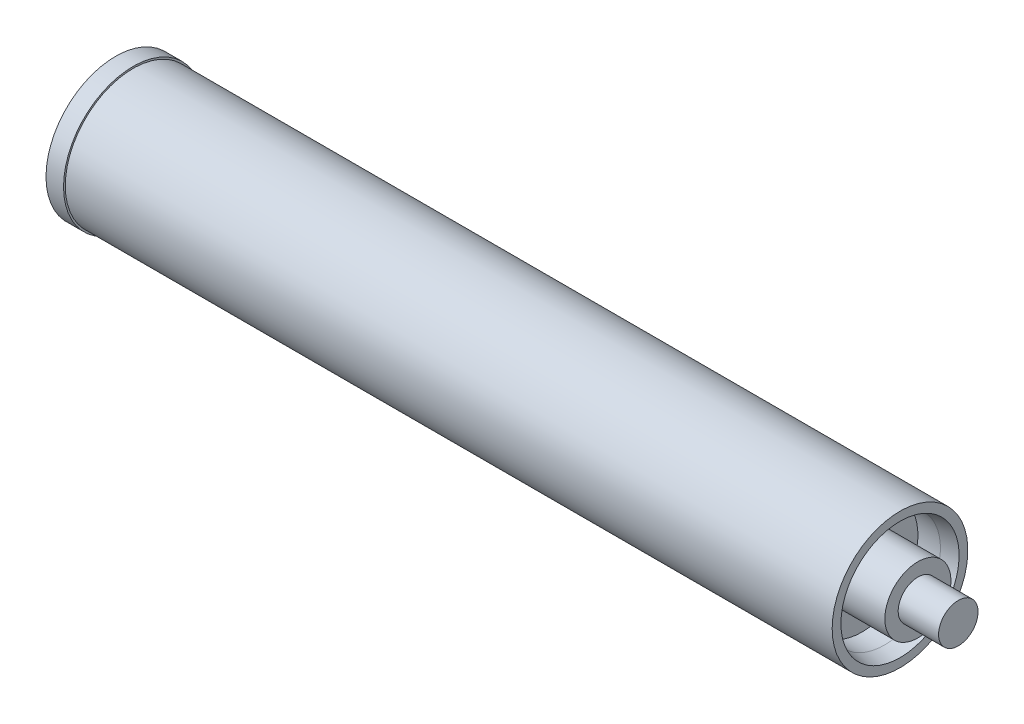
ISO-10303-21;
HEADER;
FILE_DESCRIPTION(('STEP AP214'),'2;1');
FILE_NAME('part.step','',(''),(''),'','','');
FILE_SCHEMA(('AUTOMOTIVE_DESIGN { 1 0 10303 214 1 1 1 1 }'));
ENDSEC;
DATA;
#1=APPLICATION_CONTEXT('core data for automotive mechanical design processes');
#2=APPLICATION_PROTOCOL_DEFINITION('international standard','automotive_design',2000,#1);
#3=PRODUCT_CONTEXT('',#1,'mechanical');
#4=PRODUCT('Part','Part','',(#3));
#5=PRODUCT_RELATED_PRODUCT_CATEGORY('part','',(#4));
#6=PRODUCT_DEFINITION_FORMATION('','',#4);
#7=PRODUCT_DEFINITION_CONTEXT('part definition',#1,'design');
#8=PRODUCT_DEFINITION('design','',#6,#7);
#9=PRODUCT_DEFINITION_SHAPE('','',#8);
#10=(LENGTH_UNIT() NAMED_UNIT(*) SI_UNIT(.MILLI.,.METRE.));
#11=(NAMED_UNIT(*) PLANE_ANGLE_UNIT() SI_UNIT($,.RADIAN.));
#12=(NAMED_UNIT(*) SI_UNIT($,.STERADIAN.) SOLID_ANGLE_UNIT());
#13=UNCERTAINTY_MEASURE_WITH_UNIT(LENGTH_MEASURE(1.E-05),#10,'distance_accuracy_value','');
#14=(GEOMETRIC_REPRESENTATION_CONTEXT(3) GLOBAL_UNCERTAINTY_ASSIGNED_CONTEXT((#13)) GLOBAL_UNIT_ASSIGNED_CONTEXT((#10,
#11,#12)) REPRESENTATION_CONTEXT('',''));
#15=CARTESIAN_POINT('',(0.,0.,0.));
#16=DIRECTION('',(0.,0.,1.));
#17=DIRECTION('',(1.,0.,0.));
#18=AXIS2_PLACEMENT_3D('',#15,#16,#17);
#19=CARTESIAN_POINT('',(36.5674158404261,35.6891384392189,0.));
#20=DIRECTION('',(1.,0.,0.));
#21=DIRECTION('',(0.,0.,-1.));
#22=AXIS2_PLACEMENT_3D('',#19,#20,#21);
#23=PLANE('',#22);
#24=CARTESIAN_POINT('',(36.5674158404261,0.,0.));
#25=DIRECTION('',(-1.,0.,0.));
#26=DIRECTION('',(0.,0.,1.));
#27=AXIS2_PLACEMENT_3D('',#24,#25,#26);
#28=CIRCLE('',#27,26.);
#29=CARTESIAN_POINT('',(36.5674158404261,0.,26.));
#30=VERTEX_POINT('',#29);
#31=EDGE_CURVE('E71',#30,#30,#28,.T.);
#32=ORIENTED_EDGE('',*,*,#31,.F.);
#33=EDGE_LOOP('',(#32));
#34=FACE_BOUND('',#33,.T.);
#35=CARTESIAN_POINT('',(36.5674158404261,0.,0.));
#36=DIRECTION('',(-1.,0.,0.));
#37=DIRECTION('',(0.,0.,1.));
#38=AXIS2_PLACEMENT_3D('',#35,#36,#37);
#39=CIRCLE('',#38,35.6891384392189);
#40=CARTESIAN_POINT('',(36.5674158404261,0.,35.6891384392189));
#41=VERTEX_POINT('',#40);
#42=EDGE_CURVE('E11',#41,#41,#39,.T.);
#43=ORIENTED_EDGE('',*,*,#42,.T.);
#44=EDGE_LOOP('',(#43));
#45=FACE_BOUND('',#44,.T.);
#46=ADVANCED_FACE('F34',(#34,#45),#23,.F.);
#47=CARTESIAN_POINT('',(0.,0.,0.));
#48=DIRECTION('',(-1.,0.,0.));
#49=DIRECTION('',(0.,0.,1.));
#50=AXIS2_PLACEMENT_3D('',#47,#48,#49);
#51=CYLINDRICAL_SURFACE('',#50,35.6891384392189);
#52=ORIENTED_EDGE('',*,*,#42,.F.);
#53=EDGE_LOOP('',(#52));
#54=FACE_BOUND('',#53,.T.);
#55=CARTESIAN_POINT('',(25.4,0.,0.));
#56=DIRECTION('',(-1.,0.,0.));
#57=DIRECTION('',(0.,0.,1.));
#58=AXIS2_PLACEMENT_3D('',#55,#56,#57);
#59=CIRCLE('',#58,35.6891384392189);
#60=CARTESIAN_POINT('',(25.4,0.,35.6891384392189));
#61=VERTEX_POINT('',#60);
#62=EDGE_CURVE('E40',#61,#61,#59,.T.);
#63=ORIENTED_EDGE('',*,*,#62,.T.);
#64=EDGE_LOOP('',(#63));
#65=FACE_BOUND('',#64,.T.);
#66=ADVANCED_FACE('F61',(#54,#65),#51,.F.);
#67=CARTESIAN_POINT('',(12.7,0.,0.));
#68=DIRECTION('',(-1.,0.,0.));
#69=DIRECTION('',(0.,0.,1.));
#70=AXIS2_PLACEMENT_3D('',#67,#68,#69);
#71=CONICAL_SURFACE('',#70,38.2095,0.195908259244877);
#72=ORIENTED_EDGE('',*,*,#62,.F.);
#73=EDGE_LOOP('',(#72));
#74=FACE_BOUND('',#73,.T.);
#75=CARTESIAN_POINT('',(12.7,0.,0.));
#76=DIRECTION('',(-1.,0.,0.));
#77=DIRECTION('',(0.,0.,1.));
#78=AXIS2_PLACEMENT_3D('',#75,#76,#77);
#79=CIRCLE('',#78,38.2095);
#80=CARTESIAN_POINT('',(12.7,0.,38.2095));
#81=VERTEX_POINT('',#80);
#82=EDGE_CURVE('E77',#81,#81,#79,.T.);
#83=ORIENTED_EDGE('',*,*,#82,.T.);
#84=EDGE_LOOP('',(#83));
#85=FACE_BOUND('',#84,.T.);
#86=ADVANCED_FACE('F66',(#74,#85),#71,.F.);
#87=CARTESIAN_POINT('',(12.7,50.419,0.));
#88=DIRECTION('',(1.,0.,0.));
#89=DIRECTION('',(0.,0.,-1.));
#90=AXIS2_PLACEMENT_3D('',#87,#88,#89);
#91=PLANE('',#90);
#92=ORIENTED_EDGE('',*,*,#82,.F.);
#93=EDGE_LOOP('',(#92));
#94=FACE_BOUND('',#93,.T.);
#95=CARTESIAN_POINT('',(12.7,0.,0.));
#96=DIRECTION('',(-1.,0.,0.));
#97=DIRECTION('',(0.,0.,1.));
#98=AXIS2_PLACEMENT_3D('',#95,#96,#97);
#99=CIRCLE('',#98,50.419);
#100=CARTESIAN_POINT('',(12.7,0.,50.419));
#101=VERTEX_POINT('',#100);
#102=EDGE_CURVE('E79',#101,#101,#99,.T.);
#103=ORIENTED_EDGE('',*,*,#102,.T.);
#104=EDGE_LOOP('',(#103));
#105=FACE_BOUND('',#104,.T.);
#106=ADVANCED_FACE('F193',(#94,#105),#91,.F.);
#107=CARTESIAN_POINT('',(0.,0.,0.));
#108=DIRECTION('',(-1.,0.,0.));
#109=DIRECTION('',(0.,0.,1.));
#110=AXIS2_PLACEMENT_3D('',#107,#108,#109);
#111=CYLINDRICAL_SURFACE('',#110,50.419);
#112=CARTESIAN_POINT('',(25.4,0.,0.));
#113=DIRECTION('',(-1.,0.,0.));
#114=DIRECTION('',(0.,0.,1.));
#115=AXIS2_PLACEMENT_3D('',#112,#113,#114);
#116=CIRCLE('',#115,50.419);
#117=CARTESIAN_POINT('',(25.4,0.,50.419));
#118=VERTEX_POINT('',#117);
#119=EDGE_CURVE('E84',#118,#118,#116,.T.);
#120=ORIENTED_EDGE('',*,*,#119,.T.);
#121=EDGE_LOOP('',(#120));
#122=FACE_BOUND('',#121,.T.);
#123=ORIENTED_EDGE('',*,*,#102,.F.);
#124=EDGE_LOOP('',(#123));
#125=FACE_BOUND('',#124,.T.);
#126=ADVANCED_FACE('F189',(#122,#125),#111,.T.);
#127=CARTESIAN_POINT('',(25.4,50.419,0.));
#128=DIRECTION('',(1.,0.,0.));
#129=DIRECTION('',(0.,0.,-1.));
#130=AXIS2_PLACEMENT_3D('',#127,#128,#129);
#131=PLANE('',#130);
#132=CARTESIAN_POINT('',(25.4,0.,0.));
#133=DIRECTION('',(-1.,0.,0.));
#134=DIRECTION('',(0.,0.,1.));
#135=AXIS2_PLACEMENT_3D('',#132,#133,#134);
#136=CIRCLE('',#135,49.149);
#137=CARTESIAN_POINT('',(25.4,0.,49.149));
#138=VERTEX_POINT('',#137);
#139=EDGE_CURVE('E87',#138,#138,#136,.T.);
#140=ORIENTED_EDGE('',*,*,#139,.T.);
#141=EDGE_LOOP('',(#140));
#142=FACE_BOUND('',#141,.T.);
#143=ORIENTED_EDGE('',*,*,#119,.F.);
#144=EDGE_LOOP('',(#143));
#145=FACE_BOUND('',#144,.T.);
#146=ADVANCED_FACE('F185',(#142,#145),#131,.T.);
#147=CARTESIAN_POINT('',(0.,0.,0.));
#148=DIRECTION('',(-1.,0.,0.));
#149=DIRECTION('',(0.,0.,1.));
#150=AXIS2_PLACEMENT_3D('',#147,#148,#149);
#151=CYLINDRICAL_SURFACE('',#150,49.149);
#152=CARTESIAN_POINT('',(581.02,0.,0.));
#153=DIRECTION('',(-1.,0.,0.));
#154=DIRECTION('',(0.,0.,1.));
#155=AXIS2_PLACEMENT_3D('',#152,#153,#154);
#156=CIRCLE('',#155,49.149);
#157=CARTESIAN_POINT('',(581.02,0.,49.149));
#158=VERTEX_POINT('',#157);
#159=EDGE_CURVE('E90',#158,#158,#156,.T.);
#160=ORIENTED_EDGE('',*,*,#159,.T.);
#161=EDGE_LOOP('',(#160));
#162=FACE_BOUND('',#161,.T.);
#163=ORIENTED_EDGE('',*,*,#139,.F.);
#164=EDGE_LOOP('',(#163));
#165=FACE_BOUND('',#164,.T.);
#166=ADVANCED_FACE('F181',(#162,#165),#151,.T.);
#167=CARTESIAN_POINT('',(581.02,49.149,0.));
#168=DIRECTION('',(1.,0.,0.));
#169=DIRECTION('',(0.,0.,-1.));
#170=AXIS2_PLACEMENT_3D('',#167,#168,#169);
#171=PLANE('',#170);
#172=CARTESIAN_POINT('',(581.02,0.,0.));
#173=DIRECTION('',(-1.,0.,0.));
#174=DIRECTION('',(0.,0.,1.));
#175=AXIS2_PLACEMENT_3D('',#172,#173,#174);
#176=CIRCLE('',#175,42.8201877110918);
#177=CARTESIAN_POINT('',(581.02,0.,42.8201877110918));
#178=VERTEX_POINT('',#177);
#179=EDGE_CURVE('E93',#178,#178,#176,.T.);
#180=ORIENTED_EDGE('',*,*,#179,.T.);
#181=EDGE_LOOP('',(#180));
#182=FACE_BOUND('',#181,.T.);
#183=ORIENTED_EDGE('',*,*,#159,.F.);
#184=EDGE_LOOP('',(#183));
#185=FACE_BOUND('',#184,.T.);
#186=ADVANCED_FACE('F177',(#182,#185),#171,.T.);
#187=CARTESIAN_POINT('',(581.02,0.,0.));
#188=DIRECTION('',(1.,0.,0.));
#189=DIRECTION('',(0.,0.,-1.));
#190=AXIS2_PLACEMENT_3D('',#187,#188,#189);
#191=CONICAL_SURFACE('',#190,42.8201877110918,0.195908259244877);
#192=CARTESIAN_POINT('',(569.697148349975,0.,0.));
#193=DIRECTION('',(-1.,0.,0.));
#194=DIRECTION('',(0.,0.,1.));
#195=AXIS2_PLACEMENT_3D('',#192,#193,#194);
#196=CIRCLE('',#195,40.573126289269);
#197=CARTESIAN_POINT('',(569.697148349975,0.,40.573126289269));
#198=VERTEX_POINT('',#197);
#199=EDGE_CURVE('E96',#198,#198,#196,.T.);
#200=ORIENTED_EDGE('',*,*,#199,.T.);
#201=EDGE_LOOP('',(#200));
#202=FACE_BOUND('',#201,.T.);
#203=ORIENTED_EDGE('',*,*,#179,.F.);
#204=EDGE_LOOP('',(#203));
#205=FACE_BOUND('',#204,.T.);
#206=ADVANCED_FACE('F173',(#202,#205),#191,.F.);
#207=CARTESIAN_POINT('',(0.,0.,0.));
#208=DIRECTION('',(-1.,0.,0.));
#209=DIRECTION('',(0.,0.,1.));
#210=AXIS2_PLACEMENT_3D('',#207,#208,#209);
#211=CYLINDRICAL_SURFACE('',#210,40.573126289269);
#212=CARTESIAN_POINT('',(553.411969833881,0.,0.));
#213=DIRECTION('',(-1.,0.,0.));
#214=DIRECTION('',(0.,0.,1.));
#215=AXIS2_PLACEMENT_3D('',#212,#213,#214);
#216=CIRCLE('',#215,40.573126289269);
#217=CARTESIAN_POINT('',(553.411969833881,0.,40.573126289269));
#218=VERTEX_POINT('',#217);
#219=EDGE_CURVE('E99',#218,#218,#216,.T.);
#220=ORIENTED_EDGE('',*,*,#219,.T.);
#221=EDGE_LOOP('',(#220));
#222=FACE_BOUND('',#221,.T.);
#223=ORIENTED_EDGE('',*,*,#199,.F.);
#224=EDGE_LOOP('',(#223));
#225=FACE_BOUND('',#224,.T.);
#226=ADVANCED_FACE('F169',(#222,#225),#211,.F.);
#227=CARTESIAN_POINT('',(553.411969833881,40.573126289269,0.));
#228=DIRECTION('',(1.,0.,0.));
#229=DIRECTION('',(0.,0.,-1.));
#230=AXIS2_PLACEMENT_3D('',#227,#228,#229);
#231=PLANE('',#230);
#232=CARTESIAN_POINT('',(553.411969833881,0.,0.));
#233=DIRECTION('',(-1.,0.,0.));
#234=DIRECTION('',(0.,0.,1.));
#235=AXIS2_PLACEMENT_3D('',#232,#233,#234);
#236=CIRCLE('',#235,23.9395);
#237=CARTESIAN_POINT('',(553.411969833881,0.,23.9395));
#238=VERTEX_POINT('',#237);
#239=EDGE_CURVE('E102',#238,#238,#236,.T.);
#240=ORIENTED_EDGE('',*,*,#239,.T.);
#241=EDGE_LOOP('',(#240));
#242=FACE_BOUND('',#241,.T.);
#243=ORIENTED_EDGE('',*,*,#219,.F.);
#244=EDGE_LOOP('',(#243));
#245=FACE_BOUND('',#244,.T.);
#246=ADVANCED_FACE('F165',(#242,#245),#231,.T.);
#247=CARTESIAN_POINT('',(0.,0.,0.));
#248=DIRECTION('',(-1.,0.,0.));
#249=DIRECTION('',(0.,0.,1.));
#250=AXIS2_PLACEMENT_3D('',#247,#248,#249);
#251=CYLINDRICAL_SURFACE('',#250,23.9395);
#252=CARTESIAN_POINT('',(593.98,0.,0.));
#253=DIRECTION('',(-1.,0.,0.));
#254=DIRECTION('',(0.,0.,1.));
#255=AXIS2_PLACEMENT_3D('',#252,#253,#254);
#256=CIRCLE('',#255,23.9395);
#257=CARTESIAN_POINT('',(593.98,0.,23.9395));
#258=VERTEX_POINT('',#257);
#259=EDGE_CURVE('E105',#258,#258,#256,.T.);
#260=ORIENTED_EDGE('',*,*,#259,.T.);
#261=EDGE_LOOP('',(#260));
#262=FACE_BOUND('',#261,.T.);
#263=ORIENTED_EDGE('',*,*,#239,.F.);
#264=EDGE_LOOP('',(#263));
#265=FACE_BOUND('',#264,.T.);
#266=ADVANCED_FACE('F161',(#262,#265),#251,.T.);
#267=CARTESIAN_POINT('',(593.98,23.9395,0.));
#268=DIRECTION('',(1.,0.,0.));
#269=DIRECTION('',(0.,0.,-1.));
#270=AXIS2_PLACEMENT_3D('',#267,#268,#269);
#271=PLANE('',#270);
#272=CARTESIAN_POINT('',(593.98,0.,0.));
#273=DIRECTION('',(-1.,0.,0.));
#274=DIRECTION('',(0.,0.,1.));
#275=AXIS2_PLACEMENT_3D('',#272,#273,#274);
#276=CIRCLE('',#275,14.2875);
#277=CARTESIAN_POINT('',(593.98,0.,14.2875));
#278=VERTEX_POINT('',#277);
#279=EDGE_CURVE('E108',#278,#278,#276,.T.);
#280=ORIENTED_EDGE('',*,*,#279,.T.);
#281=EDGE_LOOP('',(#280));
#282=FACE_BOUND('',#281,.T.);
#283=ORIENTED_EDGE('',*,*,#259,.F.);
#284=EDGE_LOOP('',(#283));
#285=FACE_BOUND('',#284,.T.);
#286=ADVANCED_FACE('F157',(#282,#285),#271,.T.);
#287=CARTESIAN_POINT('',(0.,0.,0.));
#288=DIRECTION('',(-1.,0.,0.));
#289=DIRECTION('',(0.,0.,1.));
#290=AXIS2_PLACEMENT_3D('',#287,#288,#289);
#291=CYLINDRICAL_SURFACE('',#290,14.2875);
#292=CARTESIAN_POINT('',(623.27,0.,0.));
#293=DIRECTION('',(-1.,0.,0.));
#294=DIRECTION('',(0.,0.,1.));
#295=AXIS2_PLACEMENT_3D('',#292,#293,#294);
#296=CIRCLE('',#295,14.2875);
#297=CARTESIAN_POINT('',(623.27,0.,14.2875));
#298=VERTEX_POINT('',#297);
#299=EDGE_CURVE('E111',#298,#298,#296,.T.);
#300=ORIENTED_EDGE('',*,*,#299,.T.);
#301=EDGE_LOOP('',(#300));
#302=FACE_BOUND('',#301,.T.);
#303=ORIENTED_EDGE('',*,*,#279,.F.);
#304=EDGE_LOOP('',(#303));
#305=FACE_BOUND('',#304,.T.);
#306=ADVANCED_FACE('F151',(#302,#305),#291,.T.);
#307=CARTESIAN_POINT('',(623.27,0.,0.));
#308=DIRECTION('',(-1.,0.,0.));
#309=DIRECTION('',(0.,0.,1.));
#310=AXIS2_PLACEMENT_3D('',#307,#308,#309);
#311=PLANE('',#310);
#312=ORIENTED_EDGE('',*,*,#299,.F.);
#313=EDGE_LOOP('',(#312));
#314=FACE_BOUND('',#313,.T.);
#315=ADVANCED_FACE('F144',(#314),#311,.F.);
#316=CARTESIAN_POINT('',(0.,26.,0.));
#317=DIRECTION('',(1.,0.,0.));
#318=DIRECTION('',(0.,0.,-1.));
#319=AXIS2_PLACEMENT_3D('',#316,#317,#318);
#320=PLANE('',#319);
#321=CARTESIAN_POINT('',(0.,0.,0.));
#322=DIRECTION('',(-1.,0.,0.));
#323=DIRECTION('',(0.,0.,1.));
#324=AXIS2_PLACEMENT_3D('',#321,#322,#323);
#325=CIRCLE('',#324,20.);
#326=CARTESIAN_POINT('',(0.,0.,20.));
#327=VERTEX_POINT('',#326);
#328=EDGE_CURVE('E135',#327,#327,#325,.T.);
#329=ORIENTED_EDGE('',*,*,#328,.F.);
#330=EDGE_LOOP('',(#329));
#331=FACE_BOUND('',#330,.T.);
#332=CARTESIAN_POINT('',(0.,0.,0.));
#333=DIRECTION('',(-1.,0.,0.));
#334=DIRECTION('',(0.,0.,1.));
#335=AXIS2_PLACEMENT_3D('',#332,#333,#334);
#336=CIRCLE('',#335,26.);
#337=CARTESIAN_POINT('',(0.,0.,26.));
#338=VERTEX_POINT('',#337);
#339=EDGE_CURVE('E114',#338,#338,#336,.T.);
#340=ORIENTED_EDGE('',*,*,#339,.T.);
#341=EDGE_LOOP('',(#340));
#342=FACE_BOUND('',#341,.T.);
#343=ADVANCED_FACE('F56',(#331,#342),#320,.F.);
#344=CARTESIAN_POINT('',(0.,0.,0.));
#345=DIRECTION('',(-1.,0.,0.));
#346=DIRECTION('',(0.,0.,1.));
#347=AXIS2_PLACEMENT_3D('',#344,#345,#346);
#348=CYLINDRICAL_SURFACE('',#347,26.);
#349=ORIENTED_EDGE('',*,*,#31,.T.);
#350=EDGE_LOOP('',(#349));
#351=FACE_BOUND('',#350,.T.);
#352=ORIENTED_EDGE('',*,*,#339,.F.);
#353=EDGE_LOOP('',(#352));
#354=FACE_BOUND('',#353,.T.);
#355=ADVANCED_FACE('F46',(#351,#354),#348,.T.);
#356=CARTESIAN_POINT('',(390.090795286598,0.,0.));
#357=DIRECTION('',(1.,0.,0.));
#358=DIRECTION('',(0.,0.,-1.));
#359=AXIS2_PLACEMENT_3D('',#356,#357,#358);
#360=CONICAL_SURFACE('',#359,0.,0.0791732676848963);
#361=CARTESIAN_POINT('',(553.411969833881,0.,0.));
#362=DIRECTION('',(-1.,0.,0.));
#363=DIRECTION('',(0.,0.,1.));
#364=AXIS2_PLACEMENT_3D('',#361,#362,#363);
#365=CIRCLE('',#364,12.9577572212731);
#366=CARTESIAN_POINT('',(553.411969833881,0.,12.9577572212731));
#367=VERTEX_POINT('',#366);
#368=EDGE_CURVE('E118',#367,#367,#365,.T.);
#369=ORIENTED_EDGE('',*,*,#368,.T.);
#370=EDGE_LOOP('',(#369));
#371=FACE_BOUND('',#370,.T.);
#372=CARTESIAN_POINT('',(390.090795286598,0.,0.));
#373=VERTEX_POINT('',#372);
#374=VERTEX_LOOP('',#373);
#375=FACE_BOUND('',#374,.T.);
#376=ADVANCED_FACE('F43',(#371,#375),#360,.T.);
#377=CARTESIAN_POINT('',(0.,0.,0.));
#378=DIRECTION('',(-1.,0.,0.));
#379=DIRECTION('',(0.,0.,1.));
#380=AXIS2_PLACEMENT_3D('',#377,#378,#379);
#381=CYLINDRICAL_SURFACE('',#380,12.9577572212731);
#382=CARTESIAN_POINT('',(381.061065958821,0.,0.));
#383=DIRECTION('',(-1.,0.,0.));
#384=DIRECTION('',(0.,0.,1.));
#385=AXIS2_PLACEMENT_3D('',#382,#383,#384);
#386=CIRCLE('',#385,12.9577572212731);
#387=CARTESIAN_POINT('',(381.061065958821,0.,12.9577572212731));
#388=VERTEX_POINT('',#387);
#389=EDGE_CURVE('E120',#388,#388,#386,.T.);
#390=ORIENTED_EDGE('',*,*,#389,.T.);
#391=EDGE_LOOP('',(#390));
#392=FACE_BOUND('',#391,.T.);
#393=ORIENTED_EDGE('',*,*,#368,.F.);
#394=EDGE_LOOP('',(#393));
#395=FACE_BOUND('',#394,.T.);
#396=ADVANCED_FACE('F45',(#392,#395),#381,.F.);
#397=CARTESIAN_POINT('',(381.061065958821,12.9577572212731,0.));
#398=DIRECTION('',(-1.,0.,0.));
#399=DIRECTION('',(0.,0.,1.));
#400=AXIS2_PLACEMENT_3D('',#397,#398,#399);
#401=PLANE('',#400);
#402=CARTESIAN_POINT('',(381.061065958821,0.,0.));
#403=DIRECTION('',(-1.,0.,0.));
#404=DIRECTION('',(0.,0.,1.));
#405=AXIS2_PLACEMENT_3D('',#402,#403,#404);
#406=CIRCLE('',#405,44.271024872523);
#407=CARTESIAN_POINT('',(381.061065958821,0.,44.271024872523));
#408=VERTEX_POINT('',#407);
#409=EDGE_CURVE('E123',#408,#408,#406,.T.);
#410=ORIENTED_EDGE('',*,*,#409,.T.);
#411=EDGE_LOOP('',(#410));
#412=FACE_BOUND('',#411,.T.);
#413=ORIENTED_EDGE('',*,*,#389,.F.);
#414=EDGE_LOOP('',(#413));
#415=FACE_BOUND('',#414,.T.);
#416=ADVANCED_FACE('F53',(#412,#415),#401,.T.);
#417=CARTESIAN_POINT('',(0.,0.,0.));
#418=DIRECTION('',(-1.,0.,0.));
#419=DIRECTION('',(0.,0.,1.));
#420=AXIS2_PLACEMENT_3D('',#417,#418,#419);
#421=CYLINDRICAL_SURFACE('',#420,44.271024872523);
#422=CARTESIAN_POINT('',(65.8718789343533,0.,0.));
#423=DIRECTION('',(-1.,0.,0.));
#424=DIRECTION('',(0.,0.,1.));
#425=AXIS2_PLACEMENT_3D('',#422,#423,#424);
#426=CIRCLE('',#425,44.271024872523);
#427=CARTESIAN_POINT('',(65.8718789343533,0.,-44.271024872523));
#428=VERTEX_POINT('',#427);
#429=EDGE_CURVE('E126',#428,#428,#426,.T.);
#430=ORIENTED_EDGE('',*,*,#429,.T.);
#431=EDGE_LOOP('',(#430));
#432=FACE_BOUND('',#431,.T.);
#433=ORIENTED_EDGE('',*,*,#409,.F.);
#434=EDGE_LOOP('',(#433));
#435=FACE_BOUND('',#434,.T.);
#436=ADVANCED_FACE('F286',(#432,#435),#421,.F.);
#437=CARTESIAN_POINT('',(65.8718789343533,0.,0.));
#438=DIRECTION('',(1.,0.,0.));
#439=DIRECTION('',(0.,0.,-1.));
#440=AXIS2_PLACEMENT_3D('',#437,#438,#439);
#441=CONICAL_SURFACE('',#440,44.271024872523,0.755513024128266);
#442=CARTESIAN_POINT('',(34.0830061399178,0.,0.));
#443=DIRECTION('',(-1.,0.,0.));
#444=DIRECTION('',(0.,0.,1.));
#445=AXIS2_PLACEMENT_3D('',#442,#443,#444);
#446=CIRCLE('',#445,14.3275804068006);
#447=CARTESIAN_POINT('',(34.0830061399178,0.,-14.3275804068006));
#448=VERTEX_POINT('',#447);
#449=EDGE_CURVE('E129',#448,#448,#446,.T.);
#450=CARTESIAN_POINT('',(34.0830061399178,0.,-14.3275804068006));
#451=CARTESIAN_POINT('',(34.4141402315265,0.,-14.6394912866519));
#452=CARTESIAN_POINT('',(34.7452743231352,0.,-14.9514021665031));
#453=CARTESIAN_POINT('',(35.4075425063526,0.,-15.5752239262057));
#454=CARTESIAN_POINT('',(35.7386765979613,0.,-15.887134806057));
#455=CARTESIAN_POINT('',(36.4009447811787,0.,-16.5109565657595));
#456=CARTESIAN_POINT('',(36.7320788727874,0.,-16.8228674456108));
#457=CARTESIAN_POINT('',(37.3943470560048,0.,-17.4466892053133));
#458=CARTESIAN_POINT('',(37.7254811476135,0.,-17.7586000851646));
#459=CARTESIAN_POINT('',(38.3877493308309,0.,-18.3824218448672));
#460=CARTESIAN_POINT('',(38.7188834224396,0.,-18.6943327247184));
#461=CARTESIAN_POINT('',(39.381151605657,0.,-19.318154484421));
#462=CARTESIAN_POINT('',(39.7122856972657,0.,-19.6300653642723));
#463=CARTESIAN_POINT('',(40.3745538804831,0.,-20.2538871239748));
#464=CARTESIAN_POINT('',(40.7056879720918,0.,-20.5657980038261));
#465=CARTESIAN_POINT('',(41.3679561553093,0.,-21.1896197635286));
#466=CARTESIAN_POINT('',(41.699090246918,0.,-21.5015306433799));
#467=CARTESIAN_POINT('',(42.3613584301354,0.,-22.1253524030825));
#468=CARTESIAN_POINT('',(42.6924925217441,0.,-22.4372632829337));
#469=CARTESIAN_POINT('',(43.3547607049615,0.,-23.0610850426363));
#470=CARTESIAN_POINT('',(43.6858947965702,0.,-23.3729959224876));
#471=CARTESIAN_POINT('',(44.3481629797876,0.,-23.9968176821901));
#472=CARTESIAN_POINT('',(44.6792970713963,0.,-24.3087285620414));
#473=CARTESIAN_POINT('',(45.3415652546137,0.,-24.9325503217439));
#474=CARTESIAN_POINT('',(45.6726993462224,0.,-25.2444612015952));
#475=CARTESIAN_POINT('',(46.3349675294398,0.,-25.8682829612978));
#476=CARTESIAN_POINT('',(46.6661016210485,0.,-26.180193841149));
#477=CARTESIAN_POINT('',(47.3283698042659,0.,-26.8040156008516));
#478=CARTESIAN_POINT('',(47.6595038958746,0.,-27.1159264807029));
#479=CARTESIAN_POINT('',(48.321772079092,0.,-27.7397482404054));
#480=CARTESIAN_POINT('',(48.6529061707007,0.,-28.0516591202567));
#481=CARTESIAN_POINT('',(49.3151743539181,0.,-28.6754808799592));
#482=CARTESIAN_POINT('',(49.6463084455268,0.,-28.9873917598105));
#483=CARTESIAN_POINT('',(50.3085766287442,0.,-29.6112135195131));
#484=CARTESIAN_POINT('',(50.6397107203529,0.,-29.9231243993643));
#485=CARTESIAN_POINT('',(51.3019789035703,0.,-30.5469461590669));
#486=CARTESIAN_POINT('',(51.633112995179,0.,-30.8588570389182));
#487=CARTESIAN_POINT('',(52.2953811783965,0.,-31.4826787986207));
#488=CARTESIAN_POINT('',(52.6265152700052,0.,-31.794589678472));
#489=CARTESIAN_POINT('',(53.2887834532226,0.,-32.4184114381745));
#490=CARTESIAN_POINT('',(53.6199175448313,0.,-32.7303223180258));
#491=CARTESIAN_POINT('',(54.2821857280487,0.,-33.3541440777284));
#492=CARTESIAN_POINT('',(54.6133198196574,0.,-33.6660549575796));
#493=CARTESIAN_POINT('',(55.2755880028748,0.,-34.2898767172822));
#494=CARTESIAN_POINT('',(55.6067220944835,0.,-34.6017875971335));
#495=CARTESIAN_POINT('',(56.2689902777009,0.,-35.225609356836));
#496=CARTESIAN_POINT('',(56.6001243693096,0.,-35.5375202366873));
#497=CARTESIAN_POINT('',(57.262392552527,0.,-36.1613419963898));
#498=CARTESIAN_POINT('',(57.5935266441357,0.,-36.4732528762411));
#499=CARTESIAN_POINT('',(58.2557948273531,0.,-37.0970746359437));
#500=CARTESIAN_POINT('',(58.5869289189618,0.,-37.4089855157949));
#501=CARTESIAN_POINT('',(59.2491971021792,0.,-38.0328072754975));
#502=CARTESIAN_POINT('',(59.5803311937879,0.,-38.3447181553488));
#503=CARTESIAN_POINT('',(60.2425993770053,0.,-38.9685399150513));
#504=CARTESIAN_POINT('',(60.573733468614,0.,-39.2804507949026));
#505=CARTESIAN_POINT('',(61.2360016518314,0.,-39.9042725546051));
#506=CARTESIAN_POINT('',(61.5671357434401,0.,-40.2161834344564));
#507=CARTESIAN_POINT('',(62.2294039266575,0.,-40.840005194159));
#508=CARTESIAN_POINT('',(62.5605380182663,0.,-41.1519160740102));
#509=CARTESIAN_POINT('',(63.2228062014837,0.,-41.7757378337128));
#510=CARTESIAN_POINT('',(63.5539402930924,0.,-42.0876487135641));
#511=CARTESIAN_POINT('',(64.2162084763098,0.,-42.7114704732666));
#512=CARTESIAN_POINT('',(64.5473425679185,0.,-43.0233813531179));
#513=CARTESIAN_POINT('',(65.2096107511359,0.,-43.6472031128204));
#514=CARTESIAN_POINT('',(65.5407448427446,0.,-43.9591139926717));
#515=CARTESIAN_POINT('',(65.8718789343533,0.,-44.271024872523));
#516=B_SPLINE_CURVE_WITH_KNOTS('',3,(#450,#451,#452,#453,#454,#455,#456,#457,#458,#459,#460,
#461,#462,#463,#464,#465,#466,#467,#468,#469,#470,#471,#472,#473,#474,#475,#476,#477,#478,#479,
#480,#481,#482,#483,#484,#485,#486,#487,#488,#489,#490,#491,#492,#493,#494,#495,#496,#497,#498,
#499,#500,#501,#502,#503,#504,#505,#506,#507,#508,#509,#510,#511,#512,#513,#514,#515),
.UNSPECIFIED.,.F.,.F.,(4,2,2,2,2,2,2,2,2,2,2,2,2,2,2,2,2,2,2,2,2,2,2,2,2,2,2,2,2,2,2,2,4),(0.,
1.36471376206004,2.72942752412007,4.09414128618011,5.45885504824014,6.82356881030018,
8.18828257236022,9.55299633442025,10.9177100964803,12.2824238585403,13.6471376206004,
15.0118513826604,16.3765651447204,17.7412789067805,19.1059926688405,20.4707064309005,
21.8354201929606,23.2001339550206,24.5648477170806,25.9295614791407,27.2942752412007,
28.6589890032608,30.0237027653208,31.3884165273808,32.7531302894409,34.1178440515009,
35.4825578135609,36.847271575621,38.211985337681,39.576699099741,40.9414128618011,
42.3061266238611,43.6708403859212),.UNSPECIFIED.);
#517=EDGE_CURVE('BSEAM296',#448,#428,#516,.T.);
#518=ORIENTED_EDGE('',*,*,#449,.T.);
#519=ORIENTED_EDGE('',*,*,#429,.F.);
#520=ORIENTED_EDGE('',*,*,#517,.T.);
#521=ORIENTED_EDGE('',*,*,#517,.F.);
#522=EDGE_LOOP('',(#518,#520,#519,#521));
#523=FACE_BOUND('',#522,.T.);
#524=ADVANCED_FACE('F296',(#523),#441,.F.);
#525=CARTESIAN_POINT('',(0.,0.,0.));
#526=DIRECTION('',(-1.,0.,0.));
#527=DIRECTION('',(0.,0.,1.));
#528=AXIS2_PLACEMENT_3D('',#525,#526,#527);
#529=CYLINDRICAL_SURFACE('',#528,14.3275804068006);
#530=CARTESIAN_POINT('',(19.0830061399178,0.,0.));
#531=DIRECTION('',(-1.,0.,0.));
#532=DIRECTION('',(0.,0.,1.));
#533=AXIS2_PLACEMENT_3D('',#530,#531,#532);
#534=CIRCLE('',#533,14.3275804068006);
#535=CARTESIAN_POINT('',(19.0830061399178,0.,14.3275804068006));
#536=VERTEX_POINT('',#535);
#537=EDGE_CURVE('E132',#536,#536,#534,.T.);
#538=ORIENTED_EDGE('',*,*,#537,.T.);
#539=EDGE_LOOP('',(#538));
#540=FACE_BOUND('',#539,.T.);
#541=ORIENTED_EDGE('',*,*,#449,.F.);
#542=EDGE_LOOP('',(#541));
#543=FACE_BOUND('',#542,.T.);
#544=ADVANCED_FACE('F306',(#540,#543),#529,.F.);
#545=CARTESIAN_POINT('',(19.0830061399178,0.,0.));
#546=DIRECTION('',(-1.,0.,0.));
#547=DIRECTION('',(0.,0.,1.));
#548=AXIS2_PLACEMENT_3D('',#545,#546,#547);
#549=CONICAL_SURFACE('',#548,14.3275804068006,0.288931761333724);
#550=ORIENTED_EDGE('',*,*,#328,.T.);
#551=EDGE_LOOP('',(#550));
#552=FACE_BOUND('',#551,.T.);
#553=ORIENTED_EDGE('',*,*,#537,.F.);
#554=EDGE_LOOP('',(#553));
#555=FACE_BOUND('',#554,.T.);
#556=ADVANCED_FACE('F139',(#552,#555),#549,.F.);
#557=CLOSED_SHELL('',(#46,#66,#86,#106,#126,#146,#166,#186,#206,#226,#246,#266,#286,#306,#315,
#343,#355,#376,#396,#416,#436,#524,#544,#556));
#558=MANIFOLD_SOLID_BREP('B2',#557);
#559=ADVANCED_BREP_SHAPE_REPRESENTATION('',(#18,#558),#14);
#560=SHAPE_DEFINITION_REPRESENTATION(#9,#559);
ENDSEC;
END-ISO-10303-21;
